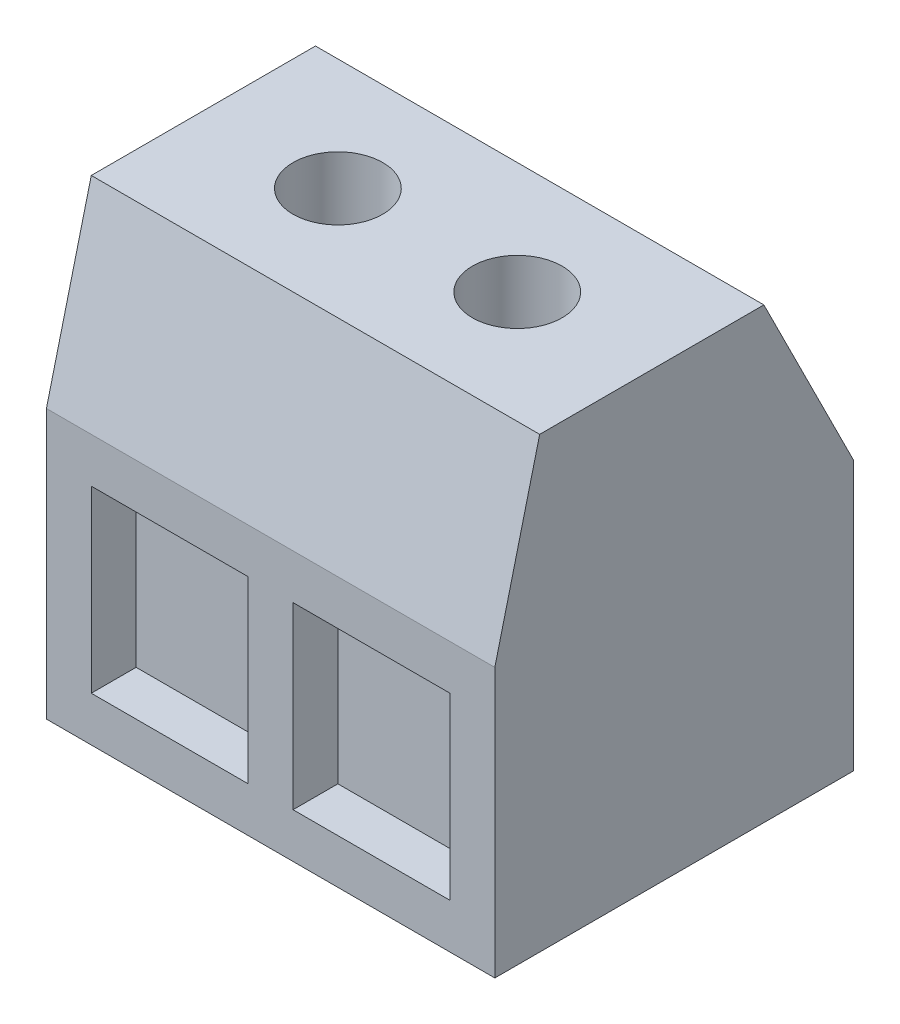
ISO-10303-21;
HEADER;
FILE_DESCRIPTION(('STEP AP214'),'2;1');
FILE_NAME('part.step','',(''),(''),'','','');
FILE_SCHEMA(('AUTOMOTIVE_DESIGN { 1 0 10303 214 1 1 1 1 }'));
ENDSEC;
DATA;
#1=APPLICATION_CONTEXT('core data for automotive mechanical design processes');
#2=APPLICATION_PROTOCOL_DEFINITION('international standard','automotive_design',2000,#1);
#3=PRODUCT_CONTEXT('',#1,'mechanical');
#4=PRODUCT('Part','Part','',(#3));
#5=PRODUCT_RELATED_PRODUCT_CATEGORY('part','',(#4));
#6=PRODUCT_DEFINITION_FORMATION('','',#4);
#7=PRODUCT_DEFINITION_CONTEXT('part definition',#1,'design');
#8=PRODUCT_DEFINITION('design','',#6,#7);
#9=PRODUCT_DEFINITION_SHAPE('','',#8);
#10=(LENGTH_UNIT() NAMED_UNIT(*) SI_UNIT(.MILLI.,.METRE.));
#11=(NAMED_UNIT(*) PLANE_ANGLE_UNIT() SI_UNIT($,.RADIAN.));
#12=(NAMED_UNIT(*) SI_UNIT($,.STERADIAN.) SOLID_ANGLE_UNIT());
#13=UNCERTAINTY_MEASURE_WITH_UNIT(LENGTH_MEASURE(1.E-05),#10,'distance_accuracy_value','');
#14=(GEOMETRIC_REPRESENTATION_CONTEXT(3) GLOBAL_UNCERTAINTY_ASSIGNED_CONTEXT((#13)) GLOBAL_UNIT_ASSIGNED_CONTEXT((#10,
#11,#12)) REPRESENTATION_CONTEXT('',''));
#15=CARTESIAN_POINT('',(0.,0.,0.));
#16=DIRECTION('',(0.,0.,1.));
#17=DIRECTION('',(1.,0.,0.));
#18=AXIS2_PLACEMENT_3D('',#15,#16,#17);
#19=CARTESIAN_POINT('',(0.,10.,0.));
#20=DIRECTION('',(1.,0.,0.));
#21=DIRECTION('',(0.,0.,-1.));
#22=AXIS2_PLACEMENT_3D('',#19,#20,#21);
#23=PLANE('',#22);
#24=DIRECTION('',(0.,0.,1.));
#25=VECTOR('',#24,1.);
#26=CARTESIAN_POINT('',(0.,10.,0.));
#27=LINE('',#26,#25);
#28=CARTESIAN_POINT('',(0.,10.,-6.));
#29=VERTEX_POINT('',#28);
#30=CARTESIAN_POINT('',(0.,10.,-1.));
#31=VERTEX_POINT('',#30);
#32=EDGE_CURVE('E232',#29,#31,#27,.T.);
#33=ORIENTED_EDGE('',*,*,#32,.F.);
#34=DIRECTION('',(0.,-0.894427190999916,-0.447213595499958));
#35=VECTOR('',#34,1.);
#36=CARTESIAN_POINT('',(0.,10.,-6.));
#37=LINE('',#36,#35);
#38=CARTESIAN_POINT('',(0.,6.,-8.));
#39=VERTEX_POINT('',#38);
#40=EDGE_CURVE('E215',#29,#39,#37,.T.);
#41=ORIENTED_EDGE('',*,*,#40,.T.);
#42=DIRECTION('',(0.,-1.,0.));
#43=VECTOR('',#42,1.);
#44=CARTESIAN_POINT('',(0.,10.,-8.));
#45=LINE('',#44,#43);
#46=CARTESIAN_POINT('',(0.,0.,-8.));
#47=VERTEX_POINT('',#46);
#48=EDGE_CURVE('E239',#39,#47,#45,.T.);
#49=ORIENTED_EDGE('',*,*,#48,.T.);
#50=DIRECTION('',(0.,0.,1.));
#51=VECTOR('',#50,1.);
#52=CARTESIAN_POINT('',(0.,0.,0.));
#53=LINE('',#52,#51);
#54=CARTESIAN_POINT('',(0.,0.,0.));
#55=VERTEX_POINT('',#54);
#56=EDGE_CURVE('E225',#47,#55,#53,.T.);
#57=ORIENTED_EDGE('',*,*,#56,.T.);
#58=DIRECTION('',(0.,-1.,0.));
#59=VECTOR('',#58,1.);
#60=CARTESIAN_POINT('',(0.,10.,0.));
#61=LINE('',#60,#59);
#62=CARTESIAN_POINT('',(0.,6.,0.));
#63=VERTEX_POINT('',#62);
#64=EDGE_CURVE('E11',#63,#55,#61,.T.);
#65=ORIENTED_EDGE('',*,*,#64,.F.);
#66=DIRECTION('',(0.,0.970142500145332,-0.242535625036333));
#67=VECTOR('',#66,1.);
#68=CARTESIAN_POINT('',(0.,6.,0.));
#69=LINE('',#68,#67);
#70=EDGE_CURVE('E212',#63,#31,#69,.T.);
#71=ORIENTED_EDGE('',*,*,#70,.T.);
#72=EDGE_LOOP('',(#33,#41,#49,#57,#65,#71));
#73=FACE_BOUND('',#72,.T.);
#74=ADVANCED_FACE('F32',(#73),#23,.F.);
#75=CARTESIAN_POINT('',(0.,10.,0.));
#76=DIRECTION('',(0.,0.,-1.));
#77=DIRECTION('',(-1.,0.,0.));
#78=AXIS2_PLACEMENT_3D('',#75,#76,#77);
#79=PLANE('',#78);
#80=DIRECTION('',(1.,0.,0.));
#81=VECTOR('',#80,1.);
#82=CARTESIAN_POINT('',(5.5,1.,0.));
#83=LINE('',#82,#81);
#84=CARTESIAN_POINT('',(5.5,0.999999999999999,0.));
#85=VERTEX_POINT('',#84);
#86=CARTESIAN_POINT('',(9.,1.,0.));
#87=VERTEX_POINT('',#86);
#88=EDGE_CURVE('E160',#85,#87,#83,.T.);
#89=ORIENTED_EDGE('',*,*,#88,.F.);
#90=DIRECTION('',(0.,-1.,0.));
#91=VECTOR('',#90,1.);
#92=CARTESIAN_POINT('',(5.5,5.,0.));
#93=LINE('',#92,#91);
#94=CARTESIAN_POINT('',(5.5,5.,0.));
#95=VERTEX_POINT('',#94);
#96=EDGE_CURVE('E46',#95,#85,#93,.T.);
#97=ORIENTED_EDGE('',*,*,#96,.F.);
#98=DIRECTION('',(-1.,0.,0.));
#99=VECTOR('',#98,1.);
#100=CARTESIAN_POINT('',(5.5,5.,0.));
#101=LINE('',#100,#99);
#102=CARTESIAN_POINT('',(9.,5.,0.));
#103=VERTEX_POINT('',#102);
#104=EDGE_CURVE('E151',#103,#95,#101,.T.);
#105=ORIENTED_EDGE('',*,*,#104,.F.);
#106=DIRECTION('',(0.,1.,0.));
#107=VECTOR('',#106,1.);
#108=CARTESIAN_POINT('',(9.,5.,0.));
#109=LINE('',#108,#107);
#110=EDGE_CURVE('E154',#87,#103,#109,.T.);
#111=ORIENTED_EDGE('',*,*,#110,.F.);
#112=EDGE_LOOP('',(#89,#97,#105,#111));
#113=FACE_BOUND('',#112,.T.);
#114=DIRECTION('',(1.,0.,0.));
#115=VECTOR('',#114,1.);
#116=CARTESIAN_POINT('',(0.999999999999999,0.999999999999999,0.));
#117=LINE('',#116,#115);
#118=CARTESIAN_POINT('',(0.999999999999999,1.,0.));
#119=VERTEX_POINT('',#118);
#120=CARTESIAN_POINT('',(4.5,1.,0.));
#121=VERTEX_POINT('',#120);
#122=EDGE_CURVE('E184',#119,#121,#117,.T.);
#123=ORIENTED_EDGE('',*,*,#122,.F.);
#124=DIRECTION('',(0.,-1.,0.));
#125=VECTOR('',#124,1.);
#126=CARTESIAN_POINT('',(1.,5.,0.));
#127=LINE('',#126,#125);
#128=CARTESIAN_POINT('',(1.,5.,0.));
#129=VERTEX_POINT('',#128);
#130=EDGE_CURVE('E54',#129,#119,#127,.T.);
#131=ORIENTED_EDGE('',*,*,#130,.F.);
#132=DIRECTION('',(-1.,0.,0.));
#133=VECTOR('',#132,1.);
#134=CARTESIAN_POINT('',(1.,5.,0.));
#135=LINE('',#134,#133);
#136=CARTESIAN_POINT('',(4.5,5.,0.));
#137=VERTEX_POINT('',#136);
#138=EDGE_CURVE('E173',#137,#129,#135,.T.);
#139=ORIENTED_EDGE('',*,*,#138,.F.);
#140=DIRECTION('',(0.,1.,0.));
#141=VECTOR('',#140,1.);
#142=CARTESIAN_POINT('',(4.5,5.,0.));
#143=LINE('',#142,#141);
#144=EDGE_CURVE('E187',#121,#137,#143,.T.);
#145=ORIENTED_EDGE('',*,*,#144,.F.);
#146=EDGE_LOOP('',(#123,#131,#139,#145));
#147=FACE_BOUND('',#146,.T.);
#148=DIRECTION('',(0.,-1.,0.));
#149=VECTOR('',#148,1.);
#150=CARTESIAN_POINT('',(10.,10.,0.));
#151=LINE('',#150,#149);
#152=CARTESIAN_POINT('',(10.,6.,0.));
#153=VERTEX_POINT('',#152);
#154=CARTESIAN_POINT('',(10.,0.,0.));
#155=VERTEX_POINT('',#154);
#156=EDGE_CURVE('E39',#153,#155,#151,.T.);
#157=ORIENTED_EDGE('',*,*,#156,.F.);
#158=DIRECTION('',(1.,0.,0.));
#159=VECTOR('',#158,1.);
#160=CARTESIAN_POINT('',(0.,6.,0.));
#161=LINE('',#160,#159);
#162=EDGE_CURVE('E219',#63,#153,#161,.T.);
#163=ORIENTED_EDGE('',*,*,#162,.F.);
#164=ORIENTED_EDGE('',*,*,#64,.T.);
#165=DIRECTION('',(1.,0.,0.));
#166=VECTOR('',#165,1.);
#167=CARTESIAN_POINT('',(0.,0.,0.));
#168=LINE('',#167,#166);
#169=EDGE_CURVE('E242',#55,#155,#168,.T.);
#170=ORIENTED_EDGE('',*,*,#169,.T.);
#171=EDGE_LOOP('',(#157,#163,#164,#170));
#172=FACE_BOUND('',#171,.T.);
#173=ADVANCED_FACE('F263',(#113,#147,#172),#79,.F.);
#174=CARTESIAN_POINT('',(10.,10.,0.));
#175=DIRECTION('',(-1.,0.,0.));
#176=DIRECTION('',(0.,0.,1.));
#177=AXIS2_PLACEMENT_3D('',#174,#175,#176);
#178=PLANE('',#177);
#179=DIRECTION('',(0.,-1.,0.));
#180=VECTOR('',#179,1.);
#181=CARTESIAN_POINT('',(10.,10.,-8.));
#182=LINE('',#181,#180);
#183=CARTESIAN_POINT('',(10.,6.,-8.));
#184=VERTEX_POINT('',#183);
#185=CARTESIAN_POINT('',(10.,0.,-8.));
#186=VERTEX_POINT('',#185);
#187=EDGE_CURVE('E251',#184,#186,#182,.T.);
#188=ORIENTED_EDGE('',*,*,#187,.F.);
#189=DIRECTION('',(0.,-0.894427190999916,-0.447213595499958));
#190=VECTOR('',#189,1.);
#191=CARTESIAN_POINT('',(10.,10.,-6.));
#192=LINE('',#191,#190);
#193=CARTESIAN_POINT('',(10.,10.,-6.));
#194=VERTEX_POINT('',#193);
#195=EDGE_CURVE('E216',#194,#184,#192,.T.);
#196=ORIENTED_EDGE('',*,*,#195,.F.);
#197=DIRECTION('',(0.,0.,-1.));
#198=VECTOR('',#197,1.);
#199=CARTESIAN_POINT('',(10.,10.,0.));
#200=LINE('',#199,#198);
#201=CARTESIAN_POINT('',(10.,10.,-1.));
#202=VERTEX_POINT('',#201);
#203=EDGE_CURVE('E235',#202,#194,#200,.T.);
#204=ORIENTED_EDGE('',*,*,#203,.F.);
#205=DIRECTION('',(0.,0.970142500145332,-0.242535625036333));
#206=VECTOR('',#205,1.);
#207=CARTESIAN_POINT('',(10.,6.,0.));
#208=LINE('',#207,#206);
#209=EDGE_CURVE('E209',#153,#202,#208,.T.);
#210=ORIENTED_EDGE('',*,*,#209,.F.);
#211=ORIENTED_EDGE('',*,*,#156,.T.);
#212=DIRECTION('',(0.,0.,-1.));
#213=VECTOR('',#212,1.);
#214=CARTESIAN_POINT('',(10.,0.,0.));
#215=LINE('',#214,#213);
#216=EDGE_CURVE('E245',#155,#186,#215,.T.);
#217=ORIENTED_EDGE('',*,*,#216,.T.);
#218=EDGE_LOOP('',(#188,#196,#204,#210,#211,#217));
#219=FACE_BOUND('',#218,.T.);
#220=ADVANCED_FACE('F256',(#219),#178,.F.);
#221=CARTESIAN_POINT('',(0.,10.,-8.));
#222=DIRECTION('',(0.,0.,1.));
#223=DIRECTION('',(1.,0.,0.));
#224=AXIS2_PLACEMENT_3D('',#221,#222,#223);
#225=PLANE('',#224);
#226=ORIENTED_EDGE('',*,*,#48,.F.);
#227=DIRECTION('',(1.,0.,0.));
#228=VECTOR('',#227,1.);
#229=CARTESIAN_POINT('',(0.,6.,-8.));
#230=LINE('',#229,#228);
#231=EDGE_CURVE('E222',#39,#184,#230,.T.);
#232=ORIENTED_EDGE('',*,*,#231,.T.);
#233=ORIENTED_EDGE('',*,*,#187,.T.);
#234=DIRECTION('',(-1.,0.,0.));
#235=VECTOR('',#234,1.);
#236=CARTESIAN_POINT('',(0.,0.,-8.));
#237=LINE('',#236,#235);
#238=EDGE_CURVE('E236',#186,#47,#237,.T.);
#239=ORIENTED_EDGE('',*,*,#238,.T.);
#240=EDGE_LOOP('',(#226,#232,#233,#239));
#241=FACE_BOUND('',#240,.T.);
#242=ADVANCED_FACE('F270',(#241),#225,.F.);
#243=CARTESIAN_POINT('',(0.,10.,0.));
#244=DIRECTION('',(0.,-1.,0.));
#245=DIRECTION('',(0.,0.,-1.));
#246=AXIS2_PLACEMENT_3D('',#243,#244,#245);
#247=PLANE('',#246);
#248=CARTESIAN_POINT('',(7.,10.,-3.5));
#249=DIRECTION('',(0.,1.,0.));
#250=DIRECTION('',(0.,0.,1.));
#251=AXIS2_PLACEMENT_3D('',#248,#249,#250);
#252=CIRCLE('',#251,1.);
#253=CARTESIAN_POINT('',(7.,10.,-2.5));
#254=VERTEX_POINT('',#253);
#255=EDGE_CURVE('E194',#254,#254,#252,.T.);
#256=ORIENTED_EDGE('',*,*,#255,.F.);
#257=EDGE_LOOP('',(#256));
#258=FACE_BOUND('',#257,.T.);
#259=CARTESIAN_POINT('',(3.,10.,-3.5));
#260=DIRECTION('',(0.,1.,0.));
#261=DIRECTION('',(0.,0.,1.));
#262=AXIS2_PLACEMENT_3D('',#259,#260,#261);
#263=CIRCLE('',#262,1.);
#264=CARTESIAN_POINT('',(3.,10.,-2.5));
#265=VERTEX_POINT('',#264);
#266=EDGE_CURVE('E203',#265,#265,#263,.T.);
#267=ORIENTED_EDGE('',*,*,#266,.F.);
#268=EDGE_LOOP('',(#267));
#269=FACE_BOUND('',#268,.T.);
#270=ORIENTED_EDGE('',*,*,#203,.T.);
#271=DIRECTION('',(1.,0.,0.));
#272=VECTOR('',#271,1.);
#273=CARTESIAN_POINT('',(0.,10.,-6.));
#274=LINE('',#273,#272);
#275=EDGE_CURVE('E226',#29,#194,#274,.T.);
#276=ORIENTED_EDGE('',*,*,#275,.F.);
#277=ORIENTED_EDGE('',*,*,#32,.T.);
#278=DIRECTION('',(1.,0.,0.));
#279=VECTOR('',#278,1.);
#280=CARTESIAN_POINT('',(0.,10.,-1.));
#281=LINE('',#280,#279);
#282=EDGE_CURVE('E228',#31,#202,#281,.T.);
#283=ORIENTED_EDGE('',*,*,#282,.T.);
#284=EDGE_LOOP('',(#270,#276,#277,#283));
#285=FACE_BOUND('',#284,.T.);
#286=ADVANCED_FACE('F275',(#258,#269,#285),#247,.F.);
#287=CARTESIAN_POINT('',(0.,0.,0.));
#288=DIRECTION('',(0.,-1.,0.));
#289=DIRECTION('',(0.,0.,-1.));
#290=AXIS2_PLACEMENT_3D('',#287,#288,#289);
#291=PLANE('',#290);
#292=ORIENTED_EDGE('',*,*,#56,.F.);
#293=ORIENTED_EDGE('',*,*,#238,.F.);
#294=ORIENTED_EDGE('',*,*,#216,.F.);
#295=ORIENTED_EDGE('',*,*,#169,.F.);
#296=EDGE_LOOP('',(#292,#293,#294,#295));
#297=FACE_BOUND('',#296,.T.);
#298=ADVANCED_FACE('F267',(#297),#291,.T.);
#299=CARTESIAN_POINT('',(0.,6.,0.));
#300=DIRECTION('',(0.,-0.242535625036333,-0.970142500145332));
#301=DIRECTION('',(0.,0.970142500145332,-0.242535625036333));
#302=AXIS2_PLACEMENT_3D('',#299,#300,#301);
#303=PLANE('',#302);
#304=ORIENTED_EDGE('',*,*,#209,.T.);
#305=ORIENTED_EDGE('',*,*,#282,.F.);
#306=ORIENTED_EDGE('',*,*,#70,.F.);
#307=ORIENTED_EDGE('',*,*,#162,.T.);
#308=EDGE_LOOP('',(#304,#305,#306,#307));
#309=FACE_BOUND('',#308,.T.);
#310=ADVANCED_FACE('F278',(#309),#303,.F.);
#311=CARTESIAN_POINT('',(0.,10.,-6.));
#312=DIRECTION('',(0.,-0.447213595499958,0.894427190999916));
#313=DIRECTION('',(0.,-0.894427190999916,-0.447213595499958));
#314=AXIS2_PLACEMENT_3D('',#311,#312,#313);
#315=PLANE('',#314);
#316=ORIENTED_EDGE('',*,*,#195,.T.);
#317=ORIENTED_EDGE('',*,*,#231,.F.);
#318=ORIENTED_EDGE('',*,*,#40,.F.);
#319=ORIENTED_EDGE('',*,*,#275,.T.);
#320=EDGE_LOOP('',(#316,#317,#318,#319));
#321=FACE_BOUND('',#320,.T.);
#322=ADVANCED_FACE('F280',(#321),#315,.F.);
#323=CARTESIAN_POINT('',(3.,8.,-3.5));
#324=DIRECTION('',(0.,1.,0.));
#325=DIRECTION('',(0.,0.,1.));
#326=AXIS2_PLACEMENT_3D('',#323,#324,#325);
#327=CYLINDRICAL_SURFACE('',#326,1.);
#328=CARTESIAN_POINT('',(3.,8.,-3.5));
#329=DIRECTION('',(0.,1.,0.));
#330=DIRECTION('',(0.,0.,1.));
#331=AXIS2_PLACEMENT_3D('',#328,#329,#330);
#332=CIRCLE('',#331,1.);
#333=CARTESIAN_POINT('',(3.,8.,-2.5));
#334=VERTEX_POINT('',#333);
#335=EDGE_CURVE('E206',#334,#334,#332,.T.);
#336=ORIENTED_EDGE('',*,*,#335,.F.);
#337=EDGE_LOOP('',(#336));
#338=FACE_BOUND('',#337,.T.);
#339=ORIENTED_EDGE('',*,*,#266,.T.);
#340=EDGE_LOOP('',(#339));
#341=FACE_BOUND('',#340,.T.);
#342=ADVANCED_FACE('F282',(#338,#341),#327,.F.);
#343=CARTESIAN_POINT('',(3.,8.,-3.5));
#344=DIRECTION('',(0.,1.,0.));
#345=DIRECTION('',(0.,0.,1.));
#346=AXIS2_PLACEMENT_3D('',#343,#344,#345);
#347=PLANE('',#346);
#348=ORIENTED_EDGE('',*,*,#335,.T.);
#349=EDGE_LOOP('',(#348));
#350=FACE_BOUND('',#349,.T.);
#351=ADVANCED_FACE('F288',(#350),#347,.T.);
#352=CARTESIAN_POINT('',(7.,8.,-3.5));
#353=DIRECTION('',(0.,1.,0.));
#354=DIRECTION('',(0.,0.,1.));
#355=AXIS2_PLACEMENT_3D('',#352,#353,#354);
#356=CYLINDRICAL_SURFACE('',#355,1.);
#357=CARTESIAN_POINT('',(7.,8.,-3.5));
#358=DIRECTION('',(0.,1.,0.));
#359=DIRECTION('',(0.,0.,1.));
#360=AXIS2_PLACEMENT_3D('',#357,#358,#359);
#361=CIRCLE('',#360,1.);
#362=CARTESIAN_POINT('',(7.,8.,-2.5));
#363=VERTEX_POINT('',#362);
#364=EDGE_CURVE('E200',#363,#363,#361,.T.);
#365=ORIENTED_EDGE('',*,*,#364,.F.);
#366=EDGE_LOOP('',(#365));
#367=FACE_BOUND('',#366,.T.);
#368=ORIENTED_EDGE('',*,*,#255,.T.);
#369=EDGE_LOOP('',(#368));
#370=FACE_BOUND('',#369,.T.);
#371=ADVANCED_FACE('F316',(#367,#370),#356,.F.);
#372=CARTESIAN_POINT('',(7.,8.,-3.5));
#373=DIRECTION('',(0.,1.,0.));
#374=DIRECTION('',(0.,0.,1.));
#375=AXIS2_PLACEMENT_3D('',#372,#373,#374);
#376=PLANE('',#375);
#377=ORIENTED_EDGE('',*,*,#364,.T.);
#378=EDGE_LOOP('',(#377));
#379=FACE_BOUND('',#378,.T.);
#380=ADVANCED_FACE('F318',(#379),#376,.T.);
#381=CARTESIAN_POINT('',(1.,5.,-1.));
#382=DIRECTION('',(-1.,0.,0.));
#383=DIRECTION('',(0.,-1.,0.));
#384=AXIS2_PLACEMENT_3D('',#381,#382,#383);
#385=PLANE('',#384);
#386=ORIENTED_EDGE('',*,*,#130,.T.);
#387=DIRECTION('',(0.,0.,1.));
#388=VECTOR('',#387,1.);
#389=CARTESIAN_POINT('',(0.999999999999999,0.999999999999999,-1.));
#390=LINE('',#389,#388);
#391=CARTESIAN_POINT('',(0.999999999999999,0.999999999999999,-1.));
#392=VERTEX_POINT('',#391);
#393=EDGE_CURVE('E182',#392,#119,#390,.T.);
#394=ORIENTED_EDGE('',*,*,#393,.F.);
#395=DIRECTION('',(0.,-1.,0.));
#396=VECTOR('',#395,1.);
#397=CARTESIAN_POINT('',(1.,5.,-1.));
#398=LINE('',#397,#396);
#399=CARTESIAN_POINT('',(1.,5.,-1.));
#400=VERTEX_POINT('',#399);
#401=EDGE_CURVE('E169',#400,#392,#398,.T.);
#402=ORIENTED_EDGE('',*,*,#401,.F.);
#403=DIRECTION('',(0.,0.,1.));
#404=VECTOR('',#403,1.);
#405=CARTESIAN_POINT('',(1.,5.,-1.));
#406=LINE('',#405,#404);
#407=EDGE_CURVE('E192',#400,#129,#406,.T.);
#408=ORIENTED_EDGE('',*,*,#407,.T.);
#409=EDGE_LOOP('',(#386,#394,#402,#408));
#410=FACE_BOUND('',#409,.T.);
#411=ADVANCED_FACE('F325',(#410),#385,.F.);
#412=CARTESIAN_POINT('',(1.,5.,-1.));
#413=DIRECTION('',(0.,1.,0.));
#414=DIRECTION('',(0.,0.,1.));
#415=AXIS2_PLACEMENT_3D('',#412,#413,#414);
#416=PLANE('',#415);
#417=ORIENTED_EDGE('',*,*,#138,.T.);
#418=ORIENTED_EDGE('',*,*,#407,.F.);
#419=DIRECTION('',(-1.,0.,0.));
#420=VECTOR('',#419,1.);
#421=CARTESIAN_POINT('',(1.,5.,-1.));
#422=LINE('',#421,#420);
#423=CARTESIAN_POINT('',(4.5,5.,-1.));
#424=VERTEX_POINT('',#423);
#425=EDGE_CURVE('E179',#424,#400,#422,.T.);
#426=ORIENTED_EDGE('',*,*,#425,.F.);
#427=DIRECTION('',(0.,0.,1.));
#428=VECTOR('',#427,1.);
#429=CARTESIAN_POINT('',(4.5,5.,-1.));
#430=LINE('',#429,#428);
#431=EDGE_CURVE('E195',#424,#137,#430,.T.);
#432=ORIENTED_EDGE('',*,*,#431,.T.);
#433=EDGE_LOOP('',(#417,#418,#426,#432));
#434=FACE_BOUND('',#433,.T.);
#435=ADVANCED_FACE('F334',(#434),#416,.F.);
#436=CARTESIAN_POINT('',(4.5,5.,-1.));
#437=DIRECTION('',(1.,0.,0.));
#438=DIRECTION('',(0.,1.,0.));
#439=AXIS2_PLACEMENT_3D('',#436,#437,#438);
#440=PLANE('',#439);
#441=ORIENTED_EDGE('',*,*,#144,.T.);
#442=ORIENTED_EDGE('',*,*,#431,.F.);
#443=DIRECTION('',(0.,1.,0.));
#444=VECTOR('',#443,1.);
#445=CARTESIAN_POINT('',(4.5,5.,-1.));
#446=LINE('',#445,#444);
#447=CARTESIAN_POINT('',(4.5,1.,-1.));
#448=VERTEX_POINT('',#447);
#449=EDGE_CURVE('E176',#448,#424,#446,.T.);
#450=ORIENTED_EDGE('',*,*,#449,.F.);
#451=DIRECTION('',(0.,0.,1.));
#452=VECTOR('',#451,1.);
#453=CARTESIAN_POINT('',(4.5,1.,-1.));
#454=LINE('',#453,#452);
#455=EDGE_CURVE('E197',#448,#121,#454,.T.);
#456=ORIENTED_EDGE('',*,*,#455,.T.);
#457=EDGE_LOOP('',(#441,#442,#450,#456));
#458=FACE_BOUND('',#457,.T.);
#459=ADVANCED_FACE('F339',(#458),#440,.F.);
#460=CARTESIAN_POINT('',(0.999999999999999,0.999999999999999,-1.));
#461=DIRECTION('',(0.,-1.,0.));
#462=DIRECTION('',(1.,0.,0.));
#463=AXIS2_PLACEMENT_3D('',#460,#461,#462);
#464=PLANE('',#463);
#465=ORIENTED_EDGE('',*,*,#122,.T.);
#466=ORIENTED_EDGE('',*,*,#455,.F.);
#467=DIRECTION('',(1.,0.,0.));
#468=VECTOR('',#467,1.);
#469=CARTESIAN_POINT('',(0.999999999999999,0.999999999999999,-1.));
#470=LINE('',#469,#468);
#471=EDGE_CURVE('E172',#392,#448,#470,.T.);
#472=ORIENTED_EDGE('',*,*,#471,.F.);
#473=ORIENTED_EDGE('',*,*,#393,.T.);
#474=EDGE_LOOP('',(#465,#466,#472,#473));
#475=FACE_BOUND('',#474,.T.);
#476=ADVANCED_FACE('F335',(#475),#464,.F.);
#477=CARTESIAN_POINT('',(0.,0.,-1.));
#478=DIRECTION('',(0.,0.,1.));
#479=DIRECTION('',(1.,0.,0.));
#480=AXIS2_PLACEMENT_3D('',#477,#478,#479);
#481=PLANE('',#480);
#482=ORIENTED_EDGE('',*,*,#401,.T.);
#483=ORIENTED_EDGE('',*,*,#471,.T.);
#484=ORIENTED_EDGE('',*,*,#449,.T.);
#485=ORIENTED_EDGE('',*,*,#425,.T.);
#486=EDGE_LOOP('',(#482,#483,#484,#485));
#487=FACE_BOUND('',#486,.T.);
#488=ADVANCED_FACE('F338',(#487),#481,.T.);
#489=CARTESIAN_POINT('',(5.5,5.,-1.));
#490=DIRECTION('',(-1.,0.,0.));
#491=DIRECTION('',(0.,-1.,0.));
#492=AXIS2_PLACEMENT_3D('',#489,#490,#491);
#493=PLANE('',#492);
#494=ORIENTED_EDGE('',*,*,#96,.T.);
#495=DIRECTION('',(0.,0.,1.));
#496=VECTOR('',#495,1.);
#497=CARTESIAN_POINT('',(5.5,1.,-1.));
#498=LINE('',#497,#496);
#499=CARTESIAN_POINT('',(5.5,1.,-1.));
#500=VERTEX_POINT('',#499);
#501=EDGE_CURVE('E129',#500,#85,#498,.T.);
#502=ORIENTED_EDGE('',*,*,#501,.F.);
#503=DIRECTION('',(0.,-1.,0.));
#504=VECTOR('',#503,1.);
#505=CARTESIAN_POINT('',(5.5,5.,-1.));
#506=LINE('',#505,#504);
#507=CARTESIAN_POINT('',(5.5,5.,-1.));
#508=VERTEX_POINT('',#507);
#509=EDGE_CURVE('E133',#508,#500,#506,.T.);
#510=ORIENTED_EDGE('',*,*,#509,.F.);
#511=DIRECTION('',(0.,0.,1.));
#512=VECTOR('',#511,1.);
#513=CARTESIAN_POINT('',(5.5,5.,-1.));
#514=LINE('',#513,#512);
#515=EDGE_CURVE('E164',#508,#95,#514,.T.);
#516=ORIENTED_EDGE('',*,*,#515,.T.);
#517=EDGE_LOOP('',(#494,#502,#510,#516));
#518=FACE_BOUND('',#517,.T.);
#519=ADVANCED_FACE('F131',(#518),#493,.F.);
#520=CARTESIAN_POINT('',(5.5,5.,-1.));
#521=DIRECTION('',(0.,1.,0.));
#522=DIRECTION('',(0.,0.,1.));
#523=AXIS2_PLACEMENT_3D('',#520,#521,#522);
#524=PLANE('',#523);
#525=ORIENTED_EDGE('',*,*,#104,.T.);
#526=ORIENTED_EDGE('',*,*,#515,.F.);
#527=DIRECTION('',(-1.,0.,0.));
#528=VECTOR('',#527,1.);
#529=CARTESIAN_POINT('',(5.5,5.,-1.));
#530=LINE('',#529,#528);
#531=CARTESIAN_POINT('',(9.,5.,-1.));
#532=VERTEX_POINT('',#531);
#533=EDGE_CURVE('E139',#532,#508,#530,.T.);
#534=ORIENTED_EDGE('',*,*,#533,.F.);
#535=DIRECTION('',(0.,0.,1.));
#536=VECTOR('',#535,1.);
#537=CARTESIAN_POINT('',(9.,5.,-1.));
#538=LINE('',#537,#536);
#539=EDGE_CURVE('E166',#532,#103,#538,.T.);
#540=ORIENTED_EDGE('',*,*,#539,.T.);
#541=EDGE_LOOP('',(#525,#526,#534,#540));
#542=FACE_BOUND('',#541,.T.);
#543=ADVANCED_FACE('F352',(#542),#524,.F.);
#544=CARTESIAN_POINT('',(9.,5.,-1.));
#545=DIRECTION('',(1.,0.,0.));
#546=DIRECTION('',(0.,0.,-1.));
#547=AXIS2_PLACEMENT_3D('',#544,#545,#546);
#548=PLANE('',#547);
#549=ORIENTED_EDGE('',*,*,#110,.T.);
#550=ORIENTED_EDGE('',*,*,#539,.F.);
#551=DIRECTION('',(0.,1.,0.));
#552=VECTOR('',#551,1.);
#553=CARTESIAN_POINT('',(9.,5.,-1.));
#554=LINE('',#553,#552);
#555=CARTESIAN_POINT('',(9.,1.,-1.));
#556=VERTEX_POINT('',#555);
#557=EDGE_CURVE('E147',#556,#532,#554,.T.);
#558=ORIENTED_EDGE('',*,*,#557,.F.);
#559=DIRECTION('',(0.,0.,1.));
#560=VECTOR('',#559,1.);
#561=CARTESIAN_POINT('',(9.,1.,-1.));
#562=LINE('',#561,#560);
#563=EDGE_CURVE('E138',#556,#87,#562,.T.);
#564=ORIENTED_EDGE('',*,*,#563,.T.);
#565=EDGE_LOOP('',(#549,#550,#558,#564));
#566=FACE_BOUND('',#565,.T.);
#567=ADVANCED_FACE('F355',(#566),#548,.F.);
#568=CARTESIAN_POINT('',(5.5,1.,-1.));
#569=DIRECTION('',(0.,-1.,0.));
#570=DIRECTION('',(0.,0.,-1.));
#571=AXIS2_PLACEMENT_3D('',#568,#569,#570);
#572=PLANE('',#571);
#573=ORIENTED_EDGE('',*,*,#88,.T.);
#574=ORIENTED_EDGE('',*,*,#563,.F.);
#575=DIRECTION('',(1.,0.,0.));
#576=VECTOR('',#575,1.);
#577=CARTESIAN_POINT('',(5.5,1.,-1.));
#578=LINE('',#577,#576);
#579=EDGE_CURVE('E142',#500,#556,#578,.T.);
#580=ORIENTED_EDGE('',*,*,#579,.F.);
#581=ORIENTED_EDGE('',*,*,#501,.T.);
#582=EDGE_LOOP('',(#573,#574,#580,#581));
#583=FACE_BOUND('',#582,.T.);
#584=ADVANCED_FACE('F143',(#583),#572,.F.);
#585=CARTESIAN_POINT('',(0.,0.,-1.));
#586=DIRECTION('',(0.,0.,1.));
#587=DIRECTION('',(1.,0.,0.));
#588=AXIS2_PLACEMENT_3D('',#585,#586,#587);
#589=PLANE('',#588);
#590=ORIENTED_EDGE('',*,*,#509,.T.);
#591=ORIENTED_EDGE('',*,*,#579,.T.);
#592=ORIENTED_EDGE('',*,*,#557,.T.);
#593=ORIENTED_EDGE('',*,*,#533,.T.);
#594=EDGE_LOOP('',(#590,#591,#592,#593));
#595=FACE_BOUND('',#594,.T.);
#596=ADVANCED_FACE('F149',(#595),#589,.T.);
#597=CLOSED_SHELL('',(#74,#173,#220,#242,#286,#298,#310,#322,#342,#351,#371,#380,#411,#435,#459,
#476,#488,#519,#543,#567,#584,#596));
#598=MANIFOLD_SOLID_BREP('B2',#597);
#599=ADVANCED_BREP_SHAPE_REPRESENTATION('',(#18,#598),#14);
#600=SHAPE_DEFINITION_REPRESENTATION(#9,#599);
ENDSEC;
END-ISO-10303-21;
